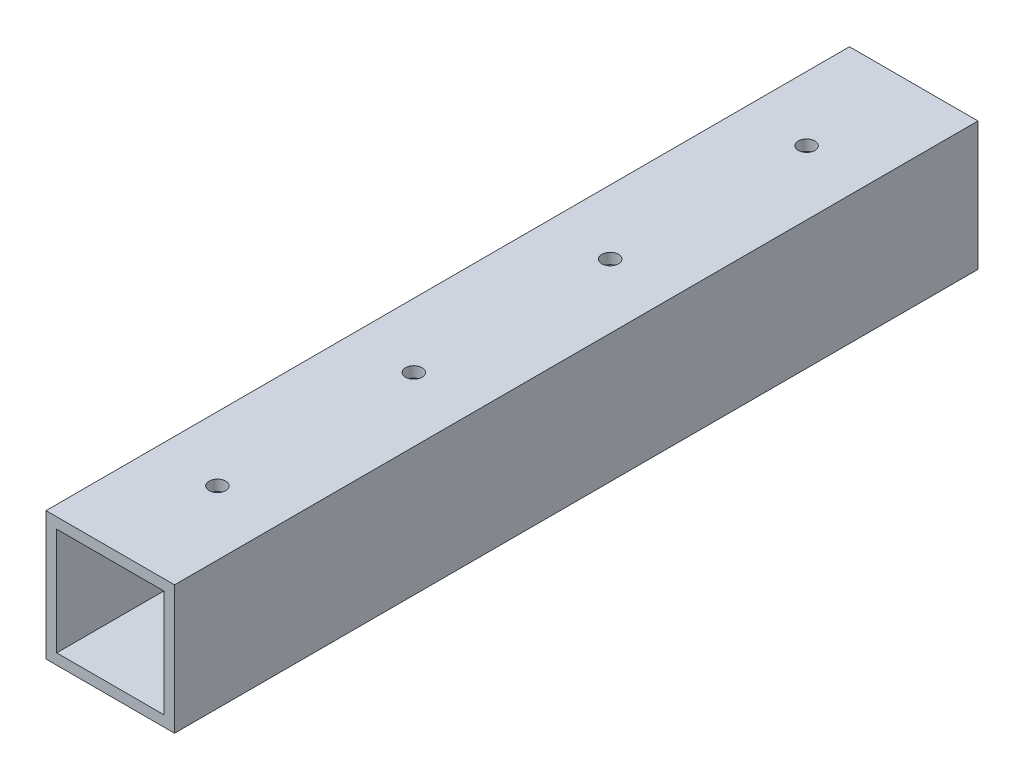
ISO-10303-21;
HEADER;
FILE_DESCRIPTION(('STEP AP214'),'2;1');
FILE_NAME('part.step','',(''),(''),'','','');
FILE_SCHEMA(('AUTOMOTIVE_DESIGN { 1 0 10303 214 1 1 1 1 }'));
ENDSEC;
DATA;
#1=APPLICATION_CONTEXT('core data for automotive mechanical design processes');
#2=APPLICATION_PROTOCOL_DEFINITION('international standard','automotive_design',2000,#1);
#3=PRODUCT_CONTEXT('',#1,'mechanical');
#4=PRODUCT('Part','Part','',(#3));
#5=PRODUCT_RELATED_PRODUCT_CATEGORY('part','',(#4));
#6=PRODUCT_DEFINITION_FORMATION('','',#4);
#7=PRODUCT_DEFINITION_CONTEXT('part definition',#1,'design');
#8=PRODUCT_DEFINITION('design','',#6,#7);
#9=PRODUCT_DEFINITION_SHAPE('','',#8);
#10=(LENGTH_UNIT() NAMED_UNIT(*) SI_UNIT(.MILLI.,.METRE.));
#11=(NAMED_UNIT(*) PLANE_ANGLE_UNIT() SI_UNIT($,.RADIAN.));
#12=(NAMED_UNIT(*) SI_UNIT($,.STERADIAN.) SOLID_ANGLE_UNIT());
#13=UNCERTAINTY_MEASURE_WITH_UNIT(LENGTH_MEASURE(1.E-05),#10,'distance_accuracy_value','');
#14=(GEOMETRIC_REPRESENTATION_CONTEXT(3) GLOBAL_UNCERTAINTY_ASSIGNED_CONTEXT((#13)) GLOBAL_UNIT_ASSIGNED_CONTEXT((#10,
#11,#12)) REPRESENTATION_CONTEXT('',''));
#15=CARTESIAN_POINT('',(0.,0.,0.));
#16=DIRECTION('',(0.,0.,1.));
#17=DIRECTION('',(1.,0.,0.));
#18=AXIS2_PLACEMENT_3D('',#15,#16,#17);
#19=CARTESIAN_POINT('',(0.,0.,238.125));
#20=DIRECTION('',(0.,0.,-1.));
#21=DIRECTION('',(-1.,0.,0.));
#22=AXIS2_PLACEMENT_3D('',#19,#20,#21);
#23=PLANE('',#22);
#24=DIRECTION('',(0.,1.,0.));
#25=VECTOR('',#24,1.);
#26=CARTESIAN_POINT('',(19.05,-19.05,238.125));
#27=LINE('',#26,#25);
#28=CARTESIAN_POINT('',(19.05,-19.05,238.125));
#29=VERTEX_POINT('',#28);
#30=CARTESIAN_POINT('',(19.05,19.05,238.125));
#31=VERTEX_POINT('',#30);
#32=EDGE_CURVE('E155',#29,#31,#27,.T.);
#33=ORIENTED_EDGE('',*,*,#32,.T.);
#34=DIRECTION('',(-1.,0.,0.));
#35=VECTOR('',#34,1.);
#36=CARTESIAN_POINT('',(-19.05,19.05,238.125));
#37=LINE('',#36,#35);
#38=CARTESIAN_POINT('',(-19.05,19.05,238.125));
#39=VERTEX_POINT('',#38);
#40=EDGE_CURVE('E159',#31,#39,#37,.T.);
#41=ORIENTED_EDGE('',*,*,#40,.T.);
#42=DIRECTION('',(0.,-1.,0.));
#43=VECTOR('',#42,1.);
#44=CARTESIAN_POINT('',(-19.05,-19.05,238.125));
#45=LINE('',#44,#43);
#46=CARTESIAN_POINT('',(-19.05,-19.05,238.125));
#47=VERTEX_POINT('',#46);
#48=EDGE_CURVE('E163',#39,#47,#45,.T.);
#49=ORIENTED_EDGE('',*,*,#48,.T.);
#50=DIRECTION('',(1.,0.,0.));
#51=VECTOR('',#50,1.);
#52=CARTESIAN_POINT('',(-19.05,-19.05,238.125));
#53=LINE('',#52,#51);
#54=EDGE_CURVE('E166',#47,#29,#53,.T.);
#55=ORIENTED_EDGE('',*,*,#54,.T.);
#56=EDGE_LOOP('',(#33,#41,#49,#55));
#57=FACE_BOUND('',#56,.T.);
#58=DIRECTION('',(0.,1.,0.));
#59=VECTOR('',#58,1.);
#60=CARTESIAN_POINT('',(15.875,-15.875,238.125));
#61=LINE('',#60,#59);
#62=CARTESIAN_POINT('',(15.875,-15.875,238.125));
#63=VERTEX_POINT('',#62);
#64=CARTESIAN_POINT('',(15.875,15.875,238.125));
#65=VERTEX_POINT('',#64);
#66=EDGE_CURVE('E104',#63,#65,#61,.T.);
#67=ORIENTED_EDGE('',*,*,#66,.F.);
#68=DIRECTION('',(1.,0.,0.));
#69=VECTOR('',#68,1.);
#70=CARTESIAN_POINT('',(-15.875,-15.875,238.125));
#71=LINE('',#70,#69);
#72=CARTESIAN_POINT('',(-15.875,-15.875,238.125));
#73=VERTEX_POINT('',#72);
#74=EDGE_CURVE('E131',#73,#63,#71,.T.);
#75=ORIENTED_EDGE('',*,*,#74,.F.);
#76=DIRECTION('',(0.,-1.,0.));
#77=VECTOR('',#76,1.);
#78=CARTESIAN_POINT('',(-15.875,-15.875,238.125));
#79=LINE('',#78,#77);
#80=CARTESIAN_POINT('',(-15.875,15.875,238.125));
#81=VERTEX_POINT('',#80);
#82=EDGE_CURVE('E126',#81,#73,#79,.T.);
#83=ORIENTED_EDGE('',*,*,#82,.F.);
#84=DIRECTION('',(-1.,0.,0.));
#85=VECTOR('',#84,1.);
#86=CARTESIAN_POINT('',(-15.875,15.875,238.125));
#87=LINE('',#86,#85);
#88=EDGE_CURVE('E113',#65,#81,#87,.T.);
#89=ORIENTED_EDGE('',*,*,#88,.F.);
#90=EDGE_LOOP('',(#67,#75,#83,#89));
#91=FACE_BOUND('',#90,.T.);
#92=ADVANCED_FACE('F36',(#57,#91),#23,.F.);
#93=CARTESIAN_POINT('',(0.,0.,0.));
#94=DIRECTION('',(0.,0.,-1.));
#95=DIRECTION('',(-1.,0.,0.));
#96=AXIS2_PLACEMENT_3D('',#93,#94,#95);
#97=PLANE('',#96);
#98=DIRECTION('',(0.,1.,0.));
#99=VECTOR('',#98,1.);
#100=CARTESIAN_POINT('',(19.05,-19.05,0.));
#101=LINE('',#100,#99);
#102=CARTESIAN_POINT('',(19.05,-19.05,0.));
#103=VERTEX_POINT('',#102);
#104=CARTESIAN_POINT('',(19.05,19.05,0.));
#105=VERTEX_POINT('',#104);
#106=EDGE_CURVE('E122',#103,#105,#101,.T.);
#107=ORIENTED_EDGE('',*,*,#106,.F.);
#108=DIRECTION('',(1.,0.,0.));
#109=VECTOR('',#108,1.);
#110=CARTESIAN_POINT('',(-19.05,-19.05,0.));
#111=LINE('',#110,#109);
#112=CARTESIAN_POINT('',(-19.05,-19.05,0.));
#113=VERTEX_POINT('',#112);
#114=EDGE_CURVE('E160',#113,#103,#111,.T.);
#115=ORIENTED_EDGE('',*,*,#114,.F.);
#116=DIRECTION('',(0.,-1.,0.));
#117=VECTOR('',#116,1.);
#118=CARTESIAN_POINT('',(-19.05,-19.05,0.));
#119=LINE('',#118,#117);
#120=CARTESIAN_POINT('',(-19.05,19.05,0.));
#121=VERTEX_POINT('',#120);
#122=EDGE_CURVE('E176',#121,#113,#119,.T.);
#123=ORIENTED_EDGE('',*,*,#122,.F.);
#124=DIRECTION('',(-1.,0.,0.));
#125=VECTOR('',#124,1.);
#126=CARTESIAN_POINT('',(-19.05,19.05,0.));
#127=LINE('',#126,#125);
#128=EDGE_CURVE('E173',#105,#121,#127,.T.);
#129=ORIENTED_EDGE('',*,*,#128,.F.);
#130=EDGE_LOOP('',(#107,#115,#123,#129));
#131=FACE_BOUND('',#130,.T.);
#132=DIRECTION('',(1.,0.,0.));
#133=VECTOR('',#132,1.);
#134=CARTESIAN_POINT('',(-15.875,-15.875,0.));
#135=LINE('',#134,#133);
#136=CARTESIAN_POINT('',(-15.875,-15.875,0.));
#137=VERTEX_POINT('',#136);
#138=CARTESIAN_POINT('',(15.875,-15.875,0.));
#139=VERTEX_POINT('',#138);
#140=EDGE_CURVE('E114',#137,#139,#135,.T.);
#141=ORIENTED_EDGE('',*,*,#140,.T.);
#142=DIRECTION('',(0.,1.,0.));
#143=VECTOR('',#142,1.);
#144=CARTESIAN_POINT('',(15.875,-15.875,0.));
#145=LINE('',#144,#143);
#146=CARTESIAN_POINT('',(15.875,15.875,0.));
#147=VERTEX_POINT('',#146);
#148=EDGE_CURVE('E62',#139,#147,#145,.T.);
#149=ORIENTED_EDGE('',*,*,#148,.T.);
#150=DIRECTION('',(-1.,0.,0.));
#151=VECTOR('',#150,1.);
#152=CARTESIAN_POINT('',(-15.875,15.875,0.));
#153=LINE('',#152,#151);
#154=CARTESIAN_POINT('',(-15.875,15.875,0.));
#155=VERTEX_POINT('',#154);
#156=EDGE_CURVE('E120',#147,#155,#153,.T.);
#157=ORIENTED_EDGE('',*,*,#156,.T.);
#158=DIRECTION('',(0.,-1.,0.));
#159=VECTOR('',#158,1.);
#160=CARTESIAN_POINT('',(-15.875,-15.875,0.));
#161=LINE('',#160,#159);
#162=EDGE_CURVE('E142',#155,#137,#161,.T.);
#163=ORIENTED_EDGE('',*,*,#162,.T.);
#164=EDGE_LOOP('',(#141,#149,#157,#163));
#165=FACE_BOUND('',#164,.T.);
#166=ADVANCED_FACE('F257',(#131,#165),#97,.T.);
#167=CARTESIAN_POINT('',(19.05,-19.05,238.125));
#168=DIRECTION('',(-1.,0.,0.));
#169=DIRECTION('',(0.,0.,1.));
#170=AXIS2_PLACEMENT_3D('',#167,#168,#169);
#171=PLANE('',#170);
#172=ORIENTED_EDGE('',*,*,#106,.T.);
#173=DIRECTION('',(0.,0.,-1.));
#174=VECTOR('',#173,1.);
#175=CARTESIAN_POINT('',(19.05,19.05,238.125));
#176=LINE('',#175,#174);
#177=EDGE_CURVE('E11',#31,#105,#176,.T.);
#178=ORIENTED_EDGE('',*,*,#177,.F.);
#179=ORIENTED_EDGE('',*,*,#32,.F.);
#180=DIRECTION('',(0.,0.,-1.));
#181=VECTOR('',#180,1.);
#182=CARTESIAN_POINT('',(19.05,-19.05,238.125));
#183=LINE('',#182,#181);
#184=EDGE_CURVE('E169',#29,#103,#183,.T.);
#185=ORIENTED_EDGE('',*,*,#184,.T.);
#186=EDGE_LOOP('',(#172,#178,#179,#185));
#187=FACE_BOUND('',#186,.T.);
#188=ADVANCED_FACE('F38',(#187),#171,.F.);
#189=CARTESIAN_POINT('',(-19.05,19.05,238.125));
#190=DIRECTION('',(0.,-1.,0.));
#191=DIRECTION('',(0.,0.,-1.));
#192=AXIS2_PLACEMENT_3D('',#189,#190,#191);
#193=PLANE('',#192);
#194=CARTESIAN_POINT('',(0.,19.05,31.75));
#195=DIRECTION('',(0.,1.,0.));
#196=DIRECTION('',(0.,0.,1.));
#197=AXIS2_PLACEMENT_3D('',#194,#195,#196);
#198=CIRCLE('',#197,2.45744999999999);
#199=CARTESIAN_POINT('',(0.,19.05,34.20745));
#200=VERTEX_POINT('',#199);
#201=EDGE_CURVE('E293',#200,#200,#198,.T.);
#202=ORIENTED_EDGE('',*,*,#201,.F.);
#203=EDGE_LOOP('',(#202));
#204=FACE_BOUND('',#203,.T.);
#205=CARTESIAN_POINT('',(2.4980018054066E-13,19.05,89.9583333333335));
#206=DIRECTION('',(0.,1.,0.));
#207=DIRECTION('',(0.,0.,1.));
#208=AXIS2_PLACEMENT_3D('',#205,#206,#207);
#209=CIRCLE('',#208,2.45744999999999);
#210=CARTESIAN_POINT('',(2.4980018054066E-13,19.05,92.4157833333335));
#211=VERTEX_POINT('',#210);
#212=EDGE_CURVE('E215',#211,#211,#209,.T.);
#213=ORIENTED_EDGE('',*,*,#212,.F.);
#214=EDGE_LOOP('',(#213));
#215=FACE_BOUND('',#214,.T.);
#216=CARTESIAN_POINT('',(8.32667268468867E-13,19.05,148.166666666667));
#217=DIRECTION('',(0.,1.,0.));
#218=DIRECTION('',(0.,0.,1.));
#219=AXIS2_PLACEMENT_3D('',#216,#217,#218);
#220=CIRCLE('',#219,2.45744999999999);
#221=CARTESIAN_POINT('',(8.32667268468867E-13,19.05,150.624116666667));
#222=VERTEX_POINT('',#221);
#223=EDGE_CURVE('E212',#222,#222,#220,.T.);
#224=ORIENTED_EDGE('',*,*,#223,.F.);
#225=EDGE_LOOP('',(#224));
#226=FACE_BOUND('',#225,.T.);
#227=CARTESIAN_POINT('',(1.83186799063151E-12,19.05,206.375));
#228=DIRECTION('',(0.,1.,0.));
#229=DIRECTION('',(0.,0.,1.));
#230=AXIS2_PLACEMENT_3D('',#227,#228,#229);
#231=CIRCLE('',#230,2.45744999999999);
#232=CARTESIAN_POINT('',(1.83186799063151E-12,19.05,208.83245));
#233=VERTEX_POINT('',#232);
#234=EDGE_CURVE('E235',#233,#233,#231,.T.);
#235=ORIENTED_EDGE('',*,*,#234,.F.);
#236=EDGE_LOOP('',(#235));
#237=FACE_BOUND('',#236,.T.);
#238=ORIENTED_EDGE('',*,*,#128,.T.);
#239=DIRECTION('',(0.,0.,-1.));
#240=VECTOR('',#239,1.);
#241=CARTESIAN_POINT('',(-19.05,19.05,238.125));
#242=LINE('',#241,#240);
#243=EDGE_CURVE('E46',#39,#121,#242,.T.);
#244=ORIENTED_EDGE('',*,*,#243,.F.);
#245=ORIENTED_EDGE('',*,*,#40,.F.);
#246=ORIENTED_EDGE('',*,*,#177,.T.);
#247=EDGE_LOOP('',(#238,#244,#245,#246));
#248=FACE_BOUND('',#247,.T.);
#249=ADVANCED_FACE('F282',(#204,#215,#226,#237,#248),#193,.F.);
#250=CARTESIAN_POINT('',(-19.05,-19.05,238.125));
#251=DIRECTION('',(1.,0.,0.));
#252=DIRECTION('',(0.,0.,-1.));
#253=AXIS2_PLACEMENT_3D('',#250,#251,#252);
#254=PLANE('',#253);
#255=ORIENTED_EDGE('',*,*,#122,.T.);
#256=DIRECTION('',(0.,0.,-1.));
#257=VECTOR('',#256,1.);
#258=CARTESIAN_POINT('',(-19.05,-19.05,238.125));
#259=LINE('',#258,#257);
#260=EDGE_CURVE('E184',#47,#113,#259,.T.);
#261=ORIENTED_EDGE('',*,*,#260,.F.);
#262=ORIENTED_EDGE('',*,*,#48,.F.);
#263=ORIENTED_EDGE('',*,*,#243,.T.);
#264=EDGE_LOOP('',(#255,#261,#262,#263));
#265=FACE_BOUND('',#264,.T.);
#266=ADVANCED_FACE('F279',(#265),#254,.F.);
#267=CARTESIAN_POINT('',(-19.05,-19.05,238.125));
#268=DIRECTION('',(0.,1.,0.));
#269=DIRECTION('',(0.,0.,1.));
#270=AXIS2_PLACEMENT_3D('',#267,#268,#269);
#271=PLANE('',#270);
#272=CARTESIAN_POINT('',(0.,-19.05,31.75));
#273=DIRECTION('',(0.,1.,0.));
#274=DIRECTION('',(0.,0.,1.));
#275=AXIS2_PLACEMENT_3D('',#272,#273,#274);
#276=CIRCLE('',#275,2.45745);
#277=CARTESIAN_POINT('',(0.,-19.05,34.20745));
#278=VERTEX_POINT('',#277);
#279=EDGE_CURVE('E342',#278,#278,#276,.T.);
#280=ORIENTED_EDGE('',*,*,#279,.T.);
#281=EDGE_LOOP('',(#280));
#282=FACE_BOUND('',#281,.T.);
#283=CARTESIAN_POINT('',(2.4980018054066E-13,-19.05,89.9583333333335));
#284=DIRECTION('',(0.,1.,0.));
#285=DIRECTION('',(0.,0.,1.));
#286=AXIS2_PLACEMENT_3D('',#283,#284,#285);
#287=CIRCLE('',#286,2.45745);
#288=CARTESIAN_POINT('',(2.4980018054066E-13,-19.05,92.4157833333335));
#289=VERTEX_POINT('',#288);
#290=EDGE_CURVE('E205',#289,#289,#287,.T.);
#291=ORIENTED_EDGE('',*,*,#290,.T.);
#292=EDGE_LOOP('',(#291));
#293=FACE_BOUND('',#292,.T.);
#294=CARTESIAN_POINT('',(8.32667268468867E-13,-19.05,148.166666666667));
#295=DIRECTION('',(0.,1.,0.));
#296=DIRECTION('',(0.,0.,1.));
#297=AXIS2_PLACEMENT_3D('',#294,#295,#296);
#298=CIRCLE('',#297,2.45745);
#299=CARTESIAN_POINT('',(8.32667268468867E-13,-19.05,150.624116666667));
#300=VERTEX_POINT('',#299);
#301=EDGE_CURVE('E200',#300,#300,#298,.T.);
#302=ORIENTED_EDGE('',*,*,#301,.T.);
#303=EDGE_LOOP('',(#302));
#304=FACE_BOUND('',#303,.T.);
#305=CARTESIAN_POINT('',(1.83186799063151E-12,-19.05,206.375));
#306=DIRECTION('',(0.,1.,0.));
#307=DIRECTION('',(0.,0.,1.));
#308=AXIS2_PLACEMENT_3D('',#305,#306,#307);
#309=CIRCLE('',#308,2.45745);
#310=CARTESIAN_POINT('',(1.83186799063151E-12,-19.05,208.83245));
#311=VERTEX_POINT('',#310);
#312=EDGE_CURVE('E195',#311,#311,#309,.T.);
#313=ORIENTED_EDGE('',*,*,#312,.T.);
#314=EDGE_LOOP('',(#313));
#315=FACE_BOUND('',#314,.T.);
#316=ORIENTED_EDGE('',*,*,#114,.T.);
#317=ORIENTED_EDGE('',*,*,#184,.F.);
#318=ORIENTED_EDGE('',*,*,#54,.F.);
#319=ORIENTED_EDGE('',*,*,#260,.T.);
#320=EDGE_LOOP('',(#316,#317,#318,#319));
#321=FACE_BOUND('',#320,.T.);
#322=ADVANCED_FACE('F276',(#282,#293,#304,#315,#321),#271,.F.);
#323=CARTESIAN_POINT('',(15.875,-15.875,238.125));
#324=DIRECTION('',(-1.,0.,0.));
#325=DIRECTION('',(0.,0.,1.));
#326=AXIS2_PLACEMENT_3D('',#323,#324,#325);
#327=PLANE('',#326);
#328=ORIENTED_EDGE('',*,*,#148,.F.);
#329=DIRECTION('',(0.,0.,-1.));
#330=VECTOR('',#329,1.);
#331=CARTESIAN_POINT('',(15.875,-15.875,238.125));
#332=LINE('',#331,#330);
#333=EDGE_CURVE('E108',#63,#139,#332,.T.);
#334=ORIENTED_EDGE('',*,*,#333,.F.);
#335=ORIENTED_EDGE('',*,*,#66,.T.);
#336=DIRECTION('',(0.,0.,-1.));
#337=VECTOR('',#336,1.);
#338=CARTESIAN_POINT('',(15.875,15.875,238.125));
#339=LINE('',#338,#337);
#340=EDGE_CURVE('E107',#65,#147,#339,.T.);
#341=ORIENTED_EDGE('',*,*,#340,.T.);
#342=EDGE_LOOP('',(#328,#334,#335,#341));
#343=FACE_BOUND('',#342,.T.);
#344=ADVANCED_FACE('F106',(#343),#327,.T.);
#345=CARTESIAN_POINT('',(-15.875,15.875,238.125));
#346=DIRECTION('',(0.,-1.,0.));
#347=DIRECTION('',(0.,0.,-1.));
#348=AXIS2_PLACEMENT_3D('',#345,#346,#347);
#349=PLANE('',#348);
#350=CARTESIAN_POINT('',(0.,15.875,31.75));
#351=DIRECTION('',(0.,-1.,0.));
#352=DIRECTION('',(0.,0.,-1.));
#353=AXIS2_PLACEMENT_3D('',#350,#351,#352);
#354=CIRCLE('',#353,2.45744999999999);
#355=CARTESIAN_POINT('',(0.,15.875,29.29255));
#356=VERTEX_POINT('',#355);
#357=EDGE_CURVE('E40',#356,#356,#354,.T.);
#358=ORIENTED_EDGE('',*,*,#357,.F.);
#359=EDGE_LOOP('',(#358));
#360=FACE_BOUND('',#359,.T.);
#361=CARTESIAN_POINT('',(2.4980018054066E-13,15.875,89.9583333333335));
#362=DIRECTION('',(0.,-1.,0.));
#363=DIRECTION('',(0.,0.,-1.));
#364=AXIS2_PLACEMENT_3D('',#361,#362,#363);
#365=CIRCLE('',#364,2.45744999999999);
#366=CARTESIAN_POINT('',(2.4980018054066E-13,15.875,87.5008833333335));
#367=VERTEX_POINT('',#366);
#368=EDGE_CURVE('E204',#367,#367,#365,.T.);
#369=ORIENTED_EDGE('',*,*,#368,.F.);
#370=EDGE_LOOP('',(#369));
#371=FACE_BOUND('',#370,.T.);
#372=CARTESIAN_POINT('',(8.32667268468867E-13,15.875,148.166666666667));
#373=DIRECTION('',(0.,-1.,0.));
#374=DIRECTION('',(0.,0.,-1.));
#375=AXIS2_PLACEMENT_3D('',#372,#373,#374);
#376=CIRCLE('',#375,2.45744999999999);
#377=CARTESIAN_POINT('',(8.32667268468867E-13,15.875,145.709216666667));
#378=VERTEX_POINT('',#377);
#379=EDGE_CURVE('E199',#378,#378,#376,.T.);
#380=ORIENTED_EDGE('',*,*,#379,.F.);
#381=EDGE_LOOP('',(#380));
#382=FACE_BOUND('',#381,.T.);
#383=CARTESIAN_POINT('',(1.83186799063151E-12,15.875,206.375));
#384=DIRECTION('',(0.,-1.,0.));
#385=DIRECTION('',(0.,0.,-1.));
#386=AXIS2_PLACEMENT_3D('',#383,#384,#385);
#387=CIRCLE('',#386,2.45744999999999);
#388=CARTESIAN_POINT('',(1.83186799063151E-12,15.875,203.91755));
#389=VERTEX_POINT('',#388);
#390=EDGE_CURVE('E191',#389,#389,#387,.T.);
#391=ORIENTED_EDGE('',*,*,#390,.F.);
#392=EDGE_LOOP('',(#391));
#393=FACE_BOUND('',#392,.T.);
#394=ORIENTED_EDGE('',*,*,#156,.F.);
#395=ORIENTED_EDGE('',*,*,#340,.F.);
#396=ORIENTED_EDGE('',*,*,#88,.T.);
#397=DIRECTION('',(0.,0.,-1.));
#398=VECTOR('',#397,1.);
#399=CARTESIAN_POINT('',(-15.875,15.875,238.125));
#400=LINE('',#399,#398);
#401=EDGE_CURVE('E123',#81,#155,#400,.T.);
#402=ORIENTED_EDGE('',*,*,#401,.T.);
#403=EDGE_LOOP('',(#394,#395,#396,#402));
#404=FACE_BOUND('',#403,.T.);
#405=ADVANCED_FACE('F117',(#360,#371,#382,#393,#404),#349,.T.);
#406=CARTESIAN_POINT('',(-15.875,-15.875,238.125));
#407=DIRECTION('',(1.,0.,0.));
#408=DIRECTION('',(0.,0.,-1.));
#409=AXIS2_PLACEMENT_3D('',#406,#407,#408);
#410=PLANE('',#409);
#411=ORIENTED_EDGE('',*,*,#162,.F.);
#412=ORIENTED_EDGE('',*,*,#401,.F.);
#413=ORIENTED_EDGE('',*,*,#82,.T.);
#414=DIRECTION('',(0.,0.,-1.));
#415=VECTOR('',#414,1.);
#416=CARTESIAN_POINT('',(-15.875,-15.875,238.125));
#417=LINE('',#416,#415);
#418=EDGE_CURVE('E54',#73,#137,#417,.T.);
#419=ORIENTED_EDGE('',*,*,#418,.T.);
#420=EDGE_LOOP('',(#411,#412,#413,#419));
#421=FACE_BOUND('',#420,.T.);
#422=ADVANCED_FACE('F252',(#421),#410,.T.);
#423=CARTESIAN_POINT('',(-15.875,-15.875,238.125));
#424=DIRECTION('',(0.,1.,0.));
#425=DIRECTION('',(0.,0.,1.));
#426=AXIS2_PLACEMENT_3D('',#423,#424,#425);
#427=PLANE('',#426);
#428=CARTESIAN_POINT('',(0.,-15.875,31.75));
#429=DIRECTION('',(0.,1.,0.));
#430=DIRECTION('',(0.,0.,1.));
#431=AXIS2_PLACEMENT_3D('',#428,#429,#430);
#432=CIRCLE('',#431,2.45744999999999);
#433=CARTESIAN_POINT('',(0.,-15.875,34.20745));
#434=VERTEX_POINT('',#433);
#435=EDGE_CURVE('E222',#434,#434,#432,.T.);
#436=ORIENTED_EDGE('',*,*,#435,.F.);
#437=EDGE_LOOP('',(#436));
#438=FACE_BOUND('',#437,.T.);
#439=CARTESIAN_POINT('',(2.4980018054066E-13,-15.875,89.9583333333335));
#440=DIRECTION('',(0.,1.,0.));
#441=DIRECTION('',(0.,0.,1.));
#442=AXIS2_PLACEMENT_3D('',#439,#440,#441);
#443=CIRCLE('',#442,2.45744999999999);
#444=CARTESIAN_POINT('',(2.4980018054066E-13,-15.875,92.4157833333335));
#445=VERTEX_POINT('',#444);
#446=EDGE_CURVE('E201',#445,#445,#443,.T.);
#447=ORIENTED_EDGE('',*,*,#446,.F.);
#448=EDGE_LOOP('',(#447));
#449=FACE_BOUND('',#448,.T.);
#450=CARTESIAN_POINT('',(8.32667268468867E-13,-15.875,148.166666666667));
#451=DIRECTION('',(0.,1.,0.));
#452=DIRECTION('',(0.,0.,1.));
#453=AXIS2_PLACEMENT_3D('',#450,#451,#452);
#454=CIRCLE('',#453,2.45744999999999);
#455=CARTESIAN_POINT('',(8.32667268468867E-13,-15.875,150.624116666667));
#456=VERTEX_POINT('',#455);
#457=EDGE_CURVE('E196',#456,#456,#454,.T.);
#458=ORIENTED_EDGE('',*,*,#457,.F.);
#459=EDGE_LOOP('',(#458));
#460=FACE_BOUND('',#459,.T.);
#461=CARTESIAN_POINT('',(1.83186799063151E-12,-15.875,206.375));
#462=DIRECTION('',(0.,1.,0.));
#463=DIRECTION('',(0.,0.,1.));
#464=AXIS2_PLACEMENT_3D('',#461,#462,#463);
#465=CIRCLE('',#464,2.45744999999999);
#466=CARTESIAN_POINT('',(1.83186799063151E-12,-15.875,208.83245));
#467=VERTEX_POINT('',#466);
#468=EDGE_CURVE('E139',#467,#467,#465,.T.);
#469=ORIENTED_EDGE('',*,*,#468,.F.);
#470=EDGE_LOOP('',(#469));
#471=FACE_BOUND('',#470,.T.);
#472=ORIENTED_EDGE('',*,*,#140,.F.);
#473=ORIENTED_EDGE('',*,*,#418,.F.);
#474=ORIENTED_EDGE('',*,*,#74,.T.);
#475=ORIENTED_EDGE('',*,*,#333,.T.);
#476=EDGE_LOOP('',(#472,#473,#474,#475));
#477=FACE_BOUND('',#476,.T.);
#478=ADVANCED_FACE('F249',(#438,#449,#460,#471,#477),#427,.T.);
#479=CARTESIAN_POINT('',(1.83186799063151E-12,19.05,206.375));
#480=DIRECTION('',(0.,1.,0.));
#481=DIRECTION('',(0.,0.,1.));
#482=AXIS2_PLACEMENT_3D('',#479,#480,#481);
#483=CYLINDRICAL_SURFACE('',#482,2.45744999999999);
#484=ORIENTED_EDGE('',*,*,#390,.T.);
#485=EDGE_LOOP('',(#484));
#486=FACE_BOUND('',#485,.T.);
#487=ORIENTED_EDGE('',*,*,#234,.T.);
#488=EDGE_LOOP('',(#487));
#489=FACE_BOUND('',#488,.T.);
#490=ADVANCED_FACE('F251',(#486,#489),#483,.F.);
#491=ORIENTED_EDGE('',*,*,#468,.T.);
#492=EDGE_LOOP('',(#491));
#493=FACE_BOUND('',#492,.T.);
#494=ORIENTED_EDGE('',*,*,#312,.F.);
#495=EDGE_LOOP('',(#494));
#496=FACE_BOUND('',#495,.T.);
#497=ADVANCED_FACE('F246',(#493,#496),#483,.F.);
#498=CARTESIAN_POINT('',(8.32667268468867E-13,19.05,148.166666666667));
#499=DIRECTION('',(0.,1.,0.));
#500=DIRECTION('',(0.,0.,1.));
#501=AXIS2_PLACEMENT_3D('',#498,#499,#500);
#502=CYLINDRICAL_SURFACE('',#501,2.45744999999999);
#503=ORIENTED_EDGE('',*,*,#457,.T.);
#504=EDGE_LOOP('',(#503));
#505=FACE_BOUND('',#504,.T.);
#506=ORIENTED_EDGE('',*,*,#301,.F.);
#507=EDGE_LOOP('',(#506));
#508=FACE_BOUND('',#507,.T.);
#509=ADVANCED_FACE('F318',(#505,#508),#502,.F.);
#510=ORIENTED_EDGE('',*,*,#379,.T.);
#511=EDGE_LOOP('',(#510));
#512=FACE_BOUND('',#511,.T.);
#513=ORIENTED_EDGE('',*,*,#223,.T.);
#514=EDGE_LOOP('',(#513));
#515=FACE_BOUND('',#514,.T.);
#516=ADVANCED_FACE('F322',(#512,#515),#502,.F.);
#517=CARTESIAN_POINT('',(2.4980018054066E-13,19.05,89.9583333333335));
#518=DIRECTION('',(0.,1.,0.));
#519=DIRECTION('',(0.,0.,1.));
#520=AXIS2_PLACEMENT_3D('',#517,#518,#519);
#521=CYLINDRICAL_SURFACE('',#520,2.45744999999999);
#522=ORIENTED_EDGE('',*,*,#446,.T.);
#523=EDGE_LOOP('',(#522));
#524=FACE_BOUND('',#523,.T.);
#525=ORIENTED_EDGE('',*,*,#290,.F.);
#526=EDGE_LOOP('',(#525));
#527=FACE_BOUND('',#526,.T.);
#528=ADVANCED_FACE('F324',(#524,#527),#521,.F.);
#529=ORIENTED_EDGE('',*,*,#368,.T.);
#530=EDGE_LOOP('',(#529));
#531=FACE_BOUND('',#530,.T.);
#532=ORIENTED_EDGE('',*,*,#212,.T.);
#533=EDGE_LOOP('',(#532));
#534=FACE_BOUND('',#533,.T.);
#535=ADVANCED_FACE('F327',(#531,#534),#521,.F.);
#536=CARTESIAN_POINT('',(0.,19.05,31.75));
#537=DIRECTION('',(0.,1.,0.));
#538=DIRECTION('',(0.,0.,1.));
#539=AXIS2_PLACEMENT_3D('',#536,#537,#538);
#540=CYLINDRICAL_SURFACE('',#539,2.45744999999999);
#541=ORIENTED_EDGE('',*,*,#357,.T.);
#542=EDGE_LOOP('',(#541));
#543=FACE_BOUND('',#542,.T.);
#544=ORIENTED_EDGE('',*,*,#201,.T.);
#545=EDGE_LOOP('',(#544));
#546=FACE_BOUND('',#545,.T.);
#547=ADVANCED_FACE('F328',(#543,#546),#540,.F.);
#548=ORIENTED_EDGE('',*,*,#435,.T.);
#549=EDGE_LOOP('',(#548));
#550=FACE_BOUND('',#549,.T.);
#551=ORIENTED_EDGE('',*,*,#279,.F.);
#552=EDGE_LOOP('',(#551));
#553=FACE_BOUND('',#552,.T.);
#554=ADVANCED_FACE('F330',(#550,#553),#540,.F.);
#555=CLOSED_SHELL('',(#92,#166,#188,#249,#266,#322,#344,#405,#422,#478,#490,#497,#509,#516,#528,
#535,#547,#554));
#556=MANIFOLD_SOLID_BREP('B2',#555);
#557=ADVANCED_BREP_SHAPE_REPRESENTATION('',(#18,#556),#14);
#558=SHAPE_DEFINITION_REPRESENTATION(#9,#557);
ENDSEC;
END-ISO-10303-21;
